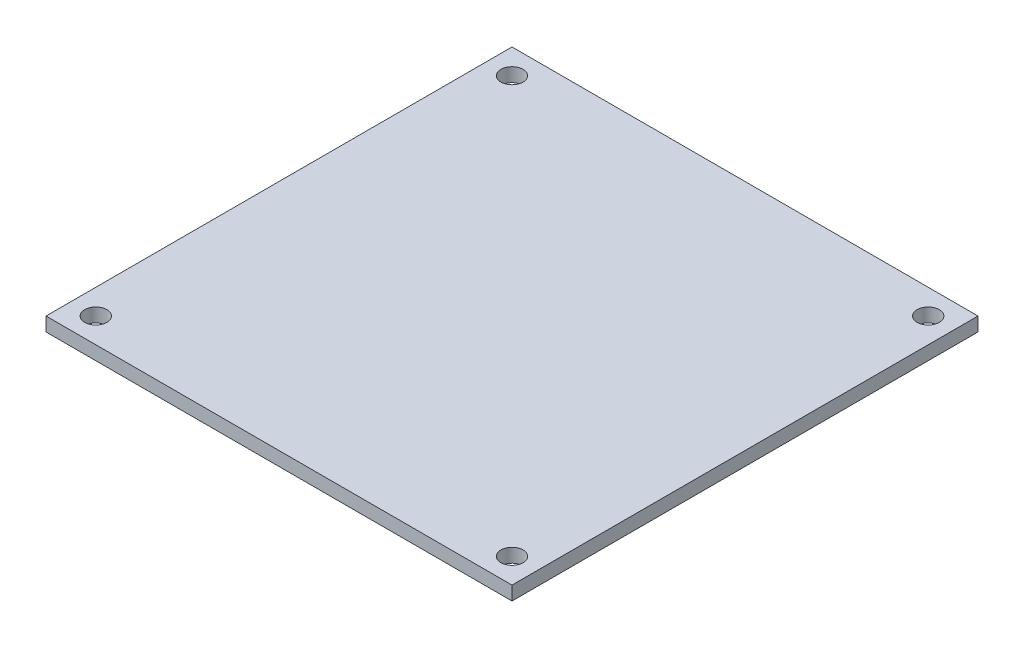
ISO-10303-21;
HEADER;
FILE_DESCRIPTION(('STEP AP214'),'2;1');
FILE_NAME('part.step','',(''),(''),'','','');
FILE_SCHEMA(('AUTOMOTIVE_DESIGN { 1 0 10303 214 1 1 1 1 }'));
ENDSEC;
DATA;
#1=APPLICATION_CONTEXT('core data for automotive mechanical design processes');
#2=APPLICATION_PROTOCOL_DEFINITION('international standard','automotive_design',2000,#1);
#3=PRODUCT_CONTEXT('',#1,'mechanical');
#4=PRODUCT('Part','Part','',(#3));
#5=PRODUCT_RELATED_PRODUCT_CATEGORY('part','',(#4));
#6=PRODUCT_DEFINITION_FORMATION('','',#4);
#7=PRODUCT_DEFINITION_CONTEXT('part definition',#1,'design');
#8=PRODUCT_DEFINITION('design','',#6,#7);
#9=PRODUCT_DEFINITION_SHAPE('','',#8);
#10=(LENGTH_UNIT() NAMED_UNIT(*) SI_UNIT(.MILLI.,.METRE.));
#11=(NAMED_UNIT(*) PLANE_ANGLE_UNIT() SI_UNIT($,.RADIAN.));
#12=(NAMED_UNIT(*) SI_UNIT($,.STERADIAN.) SOLID_ANGLE_UNIT());
#13=UNCERTAINTY_MEASURE_WITH_UNIT(LENGTH_MEASURE(1.E-05),#10,'distance_accuracy_value','');
#14=(GEOMETRIC_REPRESENTATION_CONTEXT(3) GLOBAL_UNCERTAINTY_ASSIGNED_CONTEXT((#13)) GLOBAL_UNIT_ASSIGNED_CONTEXT((#10,
#11,#12)) REPRESENTATION_CONTEXT('',''));
#15=CARTESIAN_POINT('',(0.,0.,0.));
#16=DIRECTION('',(0.,0.,1.));
#17=DIRECTION('',(1.,0.,0.));
#18=AXIS2_PLACEMENT_3D('',#15,#16,#17);
#19=CARTESIAN_POINT('',(0.,2.5,0.));
#20=DIRECTION('',(0.,-1.,0.));
#21=DIRECTION('',(0.,0.,-1.));
#22=AXIS2_PLACEMENT_3D('',#19,#20,#21);
#23=PLANE('',#22);
#24=DIRECTION('',(0.,0.,-1.));
#25=VECTOR('',#24,1.);
#26=CARTESIAN_POINT('',(42.0968675556887,2.5,42.0968675556887));
#27=LINE('',#26,#25);
#28=CARTESIAN_POINT('',(42.0968675556887,2.5,42.0968675556887));
#29=VERTEX_POINT('',#28);
#30=CARTESIAN_POINT('',(42.0968675556887,2.5,-42.0968675556887));
#31=VERTEX_POINT('',#30);
#32=EDGE_CURVE('E91',#29,#31,#27,.T.);
#33=ORIENTED_EDGE('',*,*,#32,.T.);
#34=DIRECTION('',(-1.,0.,0.));
#35=VECTOR('',#34,1.);
#36=CARTESIAN_POINT('',(-42.0968675556887,2.5,-42.0968675556887));
#37=LINE('',#36,#35);
#38=CARTESIAN_POINT('',(-42.0968675556887,2.5,-42.0968675556887));
#39=VERTEX_POINT('',#38);
#40=EDGE_CURVE('E86',#31,#39,#37,.T.);
#41=ORIENTED_EDGE('',*,*,#40,.T.);
#42=DIRECTION('',(0.,0.,1.));
#43=VECTOR('',#42,1.);
#44=CARTESIAN_POINT('',(-42.0968675556887,2.5,42.0968675556887));
#45=LINE('',#44,#43);
#46=CARTESIAN_POINT('',(-42.0968675556887,2.5,42.0968675556887));
#47=VERTEX_POINT('',#46);
#48=EDGE_CURVE('E87',#39,#47,#45,.T.);
#49=ORIENTED_EDGE('',*,*,#48,.T.);
#50=DIRECTION('',(1.,0.,0.));
#51=VECTOR('',#50,1.);
#52=CARTESIAN_POINT('',(-42.0968675556887,2.5,42.0968675556887));
#53=LINE('',#52,#51);
#54=EDGE_CURVE('E57',#47,#29,#53,.T.);
#55=ORIENTED_EDGE('',*,*,#54,.T.);
#56=EDGE_LOOP('',(#33,#41,#49,#55));
#57=FACE_BOUND('',#56,.T.);
#58=CARTESIAN_POINT('',(37.5968675556887,2.5,-37.5968675556887));
#59=DIRECTION('',(0.,1.,0.));
#60=DIRECTION('',(0.,0.,1.));
#61=AXIS2_PLACEMENT_3D('',#58,#59,#60);
#62=CIRCLE('',#61,2.);
#63=CARTESIAN_POINT('',(37.5968675556887,2.5,-35.5968675556887));
#64=VERTEX_POINT('',#63);
#65=EDGE_CURVE('E107',#64,#64,#62,.T.);
#66=ORIENTED_EDGE('',*,*,#65,.F.);
#67=EDGE_LOOP('',(#66));
#68=FACE_BOUND('',#67,.T.);
#69=CARTESIAN_POINT('',(-37.5968675556887,2.5,-37.5968675556887));
#70=DIRECTION('',(0.,1.,0.));
#71=DIRECTION('',(0.,0.,-1.));
#72=AXIS2_PLACEMENT_3D('',#69,#70,#71);
#73=CIRCLE('',#72,2.);
#74=CARTESIAN_POINT('',(-37.5968675556887,2.5,-39.5968675556887));
#75=VERTEX_POINT('',#74);
#76=EDGE_CURVE('E123',#75,#75,#73,.T.);
#77=ORIENTED_EDGE('',*,*,#76,.F.);
#78=EDGE_LOOP('',(#77));
#79=FACE_BOUND('',#78,.T.);
#80=CARTESIAN_POINT('',(-37.5968675556887,2.5,37.5968675556887));
#81=DIRECTION('',(0.,1.,0.));
#82=DIRECTION('',(0.,0.,1.));
#83=AXIS2_PLACEMENT_3D('',#80,#81,#82);
#84=CIRCLE('',#83,2.);
#85=CARTESIAN_POINT('',(-37.5968675556887,2.5,39.5968675556887));
#86=VERTEX_POINT('',#85);
#87=EDGE_CURVE('E130',#86,#86,#84,.T.);
#88=ORIENTED_EDGE('',*,*,#87,.F.);
#89=EDGE_LOOP('',(#88));
#90=FACE_BOUND('',#89,.T.);
#91=CARTESIAN_POINT('',(37.5968675556887,2.5,37.5968675556887));
#92=DIRECTION('',(0.,1.,0.));
#93=DIRECTION('',(0.,0.,-1.));
#94=AXIS2_PLACEMENT_3D('',#91,#92,#93);
#95=CIRCLE('',#94,2.);
#96=CARTESIAN_POINT('',(37.5968675556887,2.5,35.5968675556887));
#97=VERTEX_POINT('',#96);
#98=EDGE_CURVE('E133',#97,#97,#95,.T.);
#99=ORIENTED_EDGE('',*,*,#98,.F.);
#100=EDGE_LOOP('',(#99));
#101=FACE_BOUND('',#100,.T.);
#102=ADVANCED_FACE('F39',(#57,#68,#79,#90,#101),#23,.F.);
#103=CARTESIAN_POINT('',(0.,0.,0.));
#104=DIRECTION('',(0.,-1.,0.));
#105=DIRECTION('',(0.,0.,-1.));
#106=AXIS2_PLACEMENT_3D('',#103,#104,#105);
#107=PLANE('',#106);
#108=CARTESIAN_POINT('',(-37.5968675556887,0.,37.5968675556887));
#109=DIRECTION('',(0.,1.,0.));
#110=DIRECTION('',(0.,0.,1.));
#111=AXIS2_PLACEMENT_3D('',#108,#109,#110);
#112=CIRCLE('',#111,2.);
#113=CARTESIAN_POINT('',(-37.5968675556887,0.,39.5968675556887));
#114=VERTEX_POINT('',#113);
#115=EDGE_CURVE('E127',#114,#114,#112,.T.);
#116=ORIENTED_EDGE('',*,*,#115,.T.);
#117=EDGE_LOOP('',(#116));
#118=FACE_BOUND('',#117,.T.);
#119=CARTESIAN_POINT('',(37.5968675556887,0.,-37.5968675556887));
#120=DIRECTION('',(0.,1.,0.));
#121=DIRECTION('',(0.,0.,1.));
#122=AXIS2_PLACEMENT_3D('',#119,#120,#121);
#123=CIRCLE('',#122,2.);
#124=CARTESIAN_POINT('',(37.5968675556887,0.,-35.5968675556887));
#125=VERTEX_POINT('',#124);
#126=EDGE_CURVE('E118',#125,#125,#123,.T.);
#127=ORIENTED_EDGE('',*,*,#126,.T.);
#128=EDGE_LOOP('',(#127));
#129=FACE_BOUND('',#128,.T.);
#130=DIRECTION('',(0.,0.,-1.));
#131=VECTOR('',#130,1.);
#132=CARTESIAN_POINT('',(42.0968675556887,0.,42.0968675556887));
#133=LINE('',#132,#131);
#134=CARTESIAN_POINT('',(42.0968675556887,0.,42.0968675556887));
#135=VERTEX_POINT('',#134);
#136=CARTESIAN_POINT('',(42.0968675556887,0.,-42.0968675556887));
#137=VERTEX_POINT('',#136);
#138=EDGE_CURVE('E104',#135,#137,#133,.T.);
#139=ORIENTED_EDGE('',*,*,#138,.F.);
#140=DIRECTION('',(1.,0.,0.));
#141=VECTOR('',#140,1.);
#142=CARTESIAN_POINT('',(-42.0968675556887,0.,42.0968675556887));
#143=LINE('',#142,#141);
#144=CARTESIAN_POINT('',(-42.0968675556887,0.,42.0968675556887));
#145=VERTEX_POINT('',#144);
#146=EDGE_CURVE('E80',#145,#135,#143,.T.);
#147=ORIENTED_EDGE('',*,*,#146,.F.);
#148=DIRECTION('',(0.,0.,1.));
#149=VECTOR('',#148,1.);
#150=CARTESIAN_POINT('',(-42.0968675556887,0.,42.0968675556887));
#151=LINE('',#150,#149);
#152=CARTESIAN_POINT('',(-42.0968675556887,0.,-42.0968675556887));
#153=VERTEX_POINT('',#152);
#154=EDGE_CURVE('E73',#153,#145,#151,.T.);
#155=ORIENTED_EDGE('',*,*,#154,.F.);
#156=DIRECTION('',(-1.,0.,0.));
#157=VECTOR('',#156,1.);
#158=CARTESIAN_POINT('',(-42.0968675556887,0.,-42.0968675556887));
#159=LINE('',#158,#157);
#160=EDGE_CURVE('E94',#137,#153,#159,.T.);
#161=ORIENTED_EDGE('',*,*,#160,.F.);
#162=EDGE_LOOP('',(#139,#147,#155,#161));
#163=FACE_BOUND('',#162,.T.);
#164=CARTESIAN_POINT('',(-37.5968675556887,0.,-37.5968675556887));
#165=DIRECTION('',(0.,1.,0.));
#166=DIRECTION('',(0.,0.,-1.));
#167=AXIS2_PLACEMENT_3D('',#164,#165,#166);
#168=CIRCLE('',#167,2.);
#169=CARTESIAN_POINT('',(-37.5968675556887,0.,-39.5968675556887));
#170=VERTEX_POINT('',#169);
#171=EDGE_CURVE('E125',#170,#170,#168,.T.);
#172=ORIENTED_EDGE('',*,*,#171,.T.);
#173=EDGE_LOOP('',(#172));
#174=FACE_BOUND('',#173,.T.);
#175=CARTESIAN_POINT('',(37.5968675556887,0.,37.5968675556887));
#176=DIRECTION('',(0.,1.,0.));
#177=DIRECTION('',(0.,0.,-1.));
#178=AXIS2_PLACEMENT_3D('',#175,#176,#177);
#179=CIRCLE('',#178,2.);
#180=CARTESIAN_POINT('',(37.5968675556887,0.,35.5968675556887));
#181=VERTEX_POINT('',#180);
#182=EDGE_CURVE('E136',#181,#181,#179,.T.);
#183=ORIENTED_EDGE('',*,*,#182,.T.);
#184=EDGE_LOOP('',(#183));
#185=FACE_BOUND('',#184,.T.);
#186=ADVANCED_FACE('F114',(#118,#129,#163,#174,#185),#107,.T.);
#187=CARTESIAN_POINT('',(42.0968675556887,2.5,42.0968675556887));
#188=DIRECTION('',(-1.,0.,0.));
#189=DIRECTION('',(0.,0.,1.));
#190=AXIS2_PLACEMENT_3D('',#187,#188,#189);
#191=PLANE('',#190);
#192=ORIENTED_EDGE('',*,*,#138,.T.);
#193=DIRECTION('',(0.,-1.,0.));
#194=VECTOR('',#193,1.);
#195=CARTESIAN_POINT('',(42.0968675556887,2.5,-42.0968675556887));
#196=LINE('',#195,#194);
#197=EDGE_CURVE('E11',#31,#137,#196,.T.);
#198=ORIENTED_EDGE('',*,*,#197,.F.);
#199=ORIENTED_EDGE('',*,*,#32,.F.);
#200=DIRECTION('',(0.,-1.,0.));
#201=VECTOR('',#200,1.);
#202=CARTESIAN_POINT('',(42.0968675556887,2.5,42.0968675556887));
#203=LINE('',#202,#201);
#204=EDGE_CURVE('E98',#29,#135,#203,.T.);
#205=ORIENTED_EDGE('',*,*,#204,.T.);
#206=EDGE_LOOP('',(#192,#198,#199,#205));
#207=FACE_BOUND('',#206,.T.);
#208=ADVANCED_FACE('F41',(#207),#191,.F.);
#209=CARTESIAN_POINT('',(-42.0968675556887,2.5,-42.0968675556887));
#210=DIRECTION('',(0.,0.,1.));
#211=DIRECTION('',(1.,0.,0.));
#212=AXIS2_PLACEMENT_3D('',#209,#210,#211);
#213=PLANE('',#212);
#214=ORIENTED_EDGE('',*,*,#160,.T.);
#215=DIRECTION('',(0.,-1.,0.));
#216=VECTOR('',#215,1.);
#217=CARTESIAN_POINT('',(-42.0968675556887,2.5,-42.0968675556887));
#218=LINE('',#217,#216);
#219=EDGE_CURVE('E48',#39,#153,#218,.T.);
#220=ORIENTED_EDGE('',*,*,#219,.F.);
#221=ORIENTED_EDGE('',*,*,#40,.F.);
#222=ORIENTED_EDGE('',*,*,#197,.T.);
#223=EDGE_LOOP('',(#214,#220,#221,#222));
#224=FACE_BOUND('',#223,.T.);
#225=ADVANCED_FACE('F92',(#224),#213,.F.);
#226=CARTESIAN_POINT('',(-42.0968675556887,2.5,42.0968675556887));
#227=DIRECTION('',(1.,0.,0.));
#228=DIRECTION('',(0.,0.,-1.));
#229=AXIS2_PLACEMENT_3D('',#226,#227,#228);
#230=PLANE('',#229);
#231=ORIENTED_EDGE('',*,*,#154,.T.);
#232=DIRECTION('',(0.,-1.,0.));
#233=VECTOR('',#232,1.);
#234=CARTESIAN_POINT('',(-42.0968675556887,2.5,42.0968675556887));
#235=LINE('',#234,#233);
#236=EDGE_CURVE('E96',#47,#145,#235,.T.);
#237=ORIENTED_EDGE('',*,*,#236,.F.);
#238=ORIENTED_EDGE('',*,*,#48,.F.);
#239=ORIENTED_EDGE('',*,*,#219,.T.);
#240=EDGE_LOOP('',(#231,#237,#238,#239));
#241=FACE_BOUND('',#240,.T.);
#242=ADVANCED_FACE('F100',(#241),#230,.F.);
#243=CARTESIAN_POINT('',(-42.0968675556887,2.5,42.0968675556887));
#244=DIRECTION('',(0.,0.,-1.));
#245=DIRECTION('',(-1.,0.,0.));
#246=AXIS2_PLACEMENT_3D('',#243,#244,#245);
#247=PLANE('',#246);
#248=ORIENTED_EDGE('',*,*,#146,.T.);
#249=ORIENTED_EDGE('',*,*,#204,.F.);
#250=ORIENTED_EDGE('',*,*,#54,.F.);
#251=ORIENTED_EDGE('',*,*,#236,.T.);
#252=EDGE_LOOP('',(#248,#249,#250,#251));
#253=FACE_BOUND('',#252,.T.);
#254=ADVANCED_FACE('F112',(#253),#247,.F.);
#255=CARTESIAN_POINT('',(37.5968675556887,2.5,-37.5968675556887));
#256=DIRECTION('',(0.,-1.,0.));
#257=DIRECTION('',(0.,0.,-1.));
#258=AXIS2_PLACEMENT_3D('',#255,#256,#257);
#259=CYLINDRICAL_SURFACE('',#258,2.);
#260=ORIENTED_EDGE('',*,*,#65,.T.);
#261=EDGE_LOOP('',(#260));
#262=FACE_BOUND('',#261,.T.);
#263=ORIENTED_EDGE('',*,*,#126,.F.);
#264=EDGE_LOOP('',(#263));
#265=FACE_BOUND('',#264,.T.);
#266=ADVANCED_FACE('F153',(#262,#265),#259,.F.);
#267=CARTESIAN_POINT('',(-37.5968675556887,2.5,-37.5968675556887));
#268=DIRECTION('',(0.,-1.,0.));
#269=DIRECTION('',(0.,0.,-1.));
#270=AXIS2_PLACEMENT_3D('',#267,#268,#269);
#271=CYLINDRICAL_SURFACE('',#270,2.);
#272=ORIENTED_EDGE('',*,*,#76,.T.);
#273=EDGE_LOOP('',(#272));
#274=FACE_BOUND('',#273,.T.);
#275=ORIENTED_EDGE('',*,*,#171,.F.);
#276=EDGE_LOOP('',(#275));
#277=FACE_BOUND('',#276,.T.);
#278=ADVANCED_FACE('F198',(#274,#277),#271,.F.);
#279=CARTESIAN_POINT('',(-37.5968675556887,2.5,37.5968675556887));
#280=DIRECTION('',(0.,-1.,0.));
#281=DIRECTION('',(0.,0.,-1.));
#282=AXIS2_PLACEMENT_3D('',#279,#280,#281);
#283=CYLINDRICAL_SURFACE('',#282,2.);
#284=ORIENTED_EDGE('',*,*,#87,.T.);
#285=EDGE_LOOP('',(#284));
#286=FACE_BOUND('',#285,.T.);
#287=ORIENTED_EDGE('',*,*,#115,.F.);
#288=EDGE_LOOP('',(#287));
#289=FACE_BOUND('',#288,.T.);
#290=ADVANCED_FACE('F207',(#286,#289),#283,.F.);
#291=CARTESIAN_POINT('',(37.5968675556887,2.5,37.5968675556887));
#292=DIRECTION('',(0.,-1.,0.));
#293=DIRECTION('',(0.,0.,-1.));
#294=AXIS2_PLACEMENT_3D('',#291,#292,#293);
#295=CYLINDRICAL_SURFACE('',#294,2.);
#296=ORIENTED_EDGE('',*,*,#98,.T.);
#297=EDGE_LOOP('',(#296));
#298=FACE_BOUND('',#297,.T.);
#299=ORIENTED_EDGE('',*,*,#182,.F.);
#300=EDGE_LOOP('',(#299));
#301=FACE_BOUND('',#300,.T.);
#302=ADVANCED_FACE('F145',(#298,#301),#295,.F.);
#303=CLOSED_SHELL('',(#102,#186,#208,#225,#242,#254,#266,#278,#290,#302));
#304=MANIFOLD_SOLID_BREP('B2',#303);
#305=ADVANCED_BREP_SHAPE_REPRESENTATION('',(#18,#304),#14);
#306=SHAPE_DEFINITION_REPRESENTATION(#9,#305);
ENDSEC;
END-ISO-10303-21;
